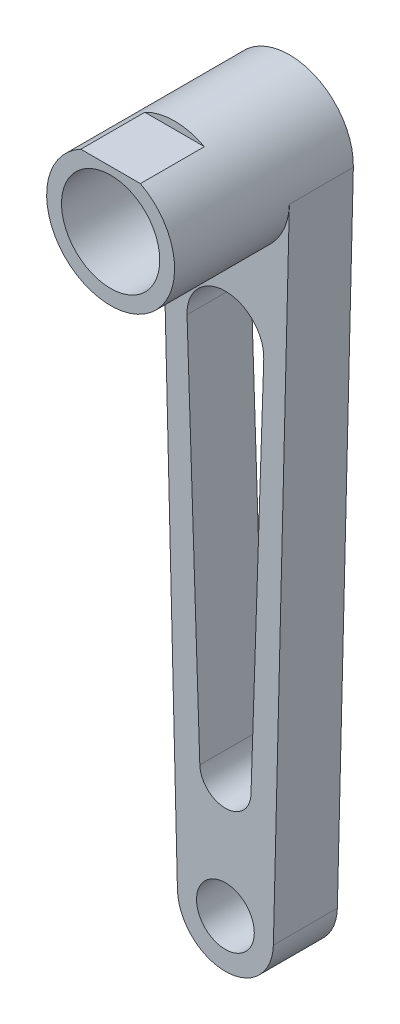
ISO-10303-21;
HEADER;
FILE_DESCRIPTION(('STEP AP214'),'2;1');
FILE_NAME('part.step','',(''),(''),'','','');
FILE_SCHEMA(('AUTOMOTIVE_DESIGN { 1 0 10303 214 1 1 1 1 }'));
ENDSEC;
DATA;
#1=APPLICATION_CONTEXT('core data for automotive mechanical design processes');
#2=APPLICATION_PROTOCOL_DEFINITION('international standard','automotive_design',2000,#1);
#3=PRODUCT_CONTEXT('',#1,'mechanical');
#4=PRODUCT('Part','Part','',(#3));
#5=PRODUCT_RELATED_PRODUCT_CATEGORY('part','',(#4));
#6=PRODUCT_DEFINITION_FORMATION('','',#4);
#7=PRODUCT_DEFINITION_CONTEXT('part definition',#1,'design');
#8=PRODUCT_DEFINITION('design','',#6,#7);
#9=PRODUCT_DEFINITION_SHAPE('','',#8);
#10=(LENGTH_UNIT() NAMED_UNIT(*) SI_UNIT(.MILLI.,.METRE.));
#11=(NAMED_UNIT(*) PLANE_ANGLE_UNIT() SI_UNIT($,.RADIAN.));
#12=(NAMED_UNIT(*) SI_UNIT($,.STERADIAN.) SOLID_ANGLE_UNIT());
#13=UNCERTAINTY_MEASURE_WITH_UNIT(LENGTH_MEASURE(1.E-05),#10,'distance_accuracy_value','');
#14=(GEOMETRIC_REPRESENTATION_CONTEXT(3) GLOBAL_UNCERTAINTY_ASSIGNED_CONTEXT((#13)) GLOBAL_UNIT_ASSIGNED_CONTEXT((#10,
#11,#12)) REPRESENTATION_CONTEXT('',''));
#15=CARTESIAN_POINT('',(0.,0.,0.));
#16=DIRECTION('',(0.,0.,1.));
#17=DIRECTION('',(1.,0.,0.));
#18=AXIS2_PLACEMENT_3D('',#15,#16,#17);
#19=CARTESIAN_POINT('',(0.,-83.,10.));
#20=DIRECTION('',(0.,0.,-1.));
#21=DIRECTION('',(-1.,0.,0.));
#22=AXIS2_PLACEMENT_3D('',#19,#20,#21);
#23=CYLINDRICAL_SURFACE('',#22,4.);
#24=CARTESIAN_POINT('',(0.,-83.,0.));
#25=DIRECTION('',(0.,0.,1.));
#26=DIRECTION('',(1.,0.,0.));
#27=AXIS2_PLACEMENT_3D('',#24,#25,#26);
#28=CIRCLE('',#27,4.);
#29=CARTESIAN_POINT('',(-3.99777716015065,-83.1333333333333,0.));
#30=VERTEX_POINT('',#29);
#31=CARTESIAN_POINT('',(3.99777716015065,-83.1333333333333,0.));
#32=VERTEX_POINT('',#31);
#33=EDGE_CURVE('E162',#30,#32,#28,.T.);
#34=ORIENTED_EDGE('',*,*,#33,.F.);
#35=DIRECTION('',(0.,0.,-1.));
#36=VECTOR('',#35,1.);
#37=CARTESIAN_POINT('',(-3.99777716015065,-83.1333333333333,10.));
#38=LINE('',#37,#36);
#39=CARTESIAN_POINT('',(-3.99777716015065,-83.1333333333333,10.));
#40=VERTEX_POINT('',#39);
#41=EDGE_CURVE('E129',#40,#30,#38,.T.);
#42=ORIENTED_EDGE('',*,*,#41,.F.);
#43=CARTESIAN_POINT('',(0.,-83.,10.));
#44=DIRECTION('',(0.,0.,1.));
#45=DIRECTION('',(1.,0.,0.));
#46=AXIS2_PLACEMENT_3D('',#43,#44,#45);
#47=CIRCLE('',#46,4.);
#48=CARTESIAN_POINT('',(3.99777716015065,-83.1333333333333,10.));
#49=VERTEX_POINT('',#48);
#50=EDGE_CURVE('E135',#40,#49,#47,.T.);
#51=ORIENTED_EDGE('',*,*,#50,.T.);
#52=DIRECTION('',(0.,0.,-1.));
#53=VECTOR('',#52,1.);
#54=CARTESIAN_POINT('',(3.99777716015065,-83.1333333333333,10.));
#55=LINE('',#54,#53);
#56=EDGE_CURVE('E97',#49,#32,#55,.T.);
#57=ORIENTED_EDGE('',*,*,#56,.T.);
#58=EDGE_LOOP('',(#34,#42,#51,#57));
#59=FACE_BOUND('',#58,.T.);
#60=ADVANCED_FACE('F41',(#59),#23,.F.);
#61=CARTESIAN_POINT('',(-6.76290636258819,-0.225555555555556,10.));
#62=DIRECTION('',(0.999444290037663,0.0333333333333333,0.));
#63=DIRECTION('',(-0.0333333333333333,0.999444290037663,0.));
#64=AXIS2_PLACEMENT_3D('',#61,#62,#63);
#65=PLANE('',#64);
#66=DIRECTION('',(0.0333333333333333,-0.999444290037663,0.));
#67=VECTOR('',#66,1.);
#68=CARTESIAN_POINT('',(-6.76290636258819,-0.225555555555556,0.));
#69=LINE('',#68,#67);
#70=CARTESIAN_POINT('',(-5.99666574022598,-23.2,0.));
#71=VERTEX_POINT('',#70);
#72=EDGE_CURVE('E123',#71,#30,#69,.T.);
#73=ORIENTED_EDGE('',*,*,#72,.F.);
#74=DIRECTION('',(0.,0.,-1.));
#75=VECTOR('',#74,1.);
#76=CARTESIAN_POINT('',(-5.99666574022598,-23.2,10.));
#77=LINE('',#76,#75);
#78=CARTESIAN_POINT('',(-5.99666574022598,-23.2,10.));
#79=VERTEX_POINT('',#78);
#80=EDGE_CURVE('E118',#79,#71,#77,.T.);
#81=ORIENTED_EDGE('',*,*,#80,.F.);
#82=DIRECTION('',(0.0333333333333333,-0.999444290037663,0.));
#83=VECTOR('',#82,1.);
#84=CARTESIAN_POINT('',(-6.76290636258819,-0.225555555555556,10.));
#85=LINE('',#84,#83);
#86=EDGE_CURVE('E121',#79,#40,#85,.T.);
#87=ORIENTED_EDGE('',*,*,#86,.T.);
#88=ORIENTED_EDGE('',*,*,#41,.T.);
#89=EDGE_LOOP('',(#73,#81,#87,#88));
#90=FACE_BOUND('',#89,.T.);
#91=ADVANCED_FACE('F120',(#90),#65,.T.);
#92=CARTESIAN_POINT('',(0.,-23.,10.));
#93=DIRECTION('',(0.,0.,-1.));
#94=DIRECTION('',(-1.,0.,0.));
#95=AXIS2_PLACEMENT_3D('',#92,#93,#94);
#96=CYLINDRICAL_SURFACE('',#95,6.);
#97=CARTESIAN_POINT('',(0.,-23.,0.));
#98=DIRECTION('',(0.,0.,1.));
#99=DIRECTION('',(1.,0.,0.));
#100=AXIS2_PLACEMENT_3D('',#97,#98,#99);
#101=CIRCLE('',#100,6.);
#102=CARTESIAN_POINT('',(5.99666574022598,-23.2,0.));
#103=VERTEX_POINT('',#102);
#104=EDGE_CURVE('E168',#103,#71,#101,.T.);
#105=ORIENTED_EDGE('',*,*,#104,.F.);
#106=DIRECTION('',(0.,0.,-1.));
#107=VECTOR('',#106,1.);
#108=CARTESIAN_POINT('',(5.99666574022598,-23.2,10.));
#109=LINE('',#108,#107);
#110=CARTESIAN_POINT('',(5.99666574022598,-23.2,10.));
#111=VERTEX_POINT('',#110);
#112=EDGE_CURVE('E130',#111,#103,#109,.T.);
#113=ORIENTED_EDGE('',*,*,#112,.F.);
#114=CARTESIAN_POINT('',(0.,-23.,10.));
#115=DIRECTION('',(0.,0.,1.));
#116=DIRECTION('',(1.,0.,0.));
#117=AXIS2_PLACEMENT_3D('',#114,#115,#116);
#118=CIRCLE('',#117,6.);
#119=EDGE_CURVE('E134',#111,#79,#118,.T.);
#120=ORIENTED_EDGE('',*,*,#119,.T.);
#121=ORIENTED_EDGE('',*,*,#80,.T.);
#122=EDGE_LOOP('',(#105,#113,#120,#121));
#123=FACE_BOUND('',#122,.T.);
#124=ADVANCED_FACE('F138',(#123),#96,.F.);
#125=CARTESIAN_POINT('',(-9.99697219181418,-0.246062992125984,10.));
#126=DIRECTION('',(0.999697219181418,0.0246062992125984,0.));
#127=DIRECTION('',(-0.0246062992125984,0.999697219181418,0.));
#128=AXIS2_PLACEMENT_3D('',#125,#126,#127);
#129=PLANE('',#128);
#130=DIRECTION('',(0.0246062992125984,-0.999697219181418,0.));
#131=VECTOR('',#130,1.);
#132=CARTESIAN_POINT('',(-9.99697219181418,-0.246062992125984,0.));
#133=LINE('',#132,#131);
#134=CARTESIAN_POINT('',(-9.99697219181418,-0.246062992125984,0.));
#135=VERTEX_POINT('',#134);
#136=CARTESIAN_POINT('',(-7.49772914386064,-101.784547244094,0.));
#137=VERTEX_POINT('',#136);
#138=EDGE_CURVE('E150',#135,#137,#133,.T.);
#139=ORIENTED_EDGE('',*,*,#138,.T.);
#140=DIRECTION('',(0.,0.,-1.));
#141=VECTOR('',#140,1.);
#142=CARTESIAN_POINT('',(-7.49772914386064,-101.784547244094,10.));
#143=LINE('',#142,#141);
#144=CARTESIAN_POINT('',(-7.49772914386064,-101.784547244094,10.));
#145=VERTEX_POINT('',#144);
#146=EDGE_CURVE('E181',#145,#137,#143,.T.);
#147=ORIENTED_EDGE('',*,*,#146,.F.);
#148=DIRECTION('',(0.0246062992125984,-0.999697219181418,0.));
#149=VECTOR('',#148,1.);
#150=CARTESIAN_POINT('',(-9.99697219181418,-0.246062992125984,10.));
#151=LINE('',#150,#149);
#152=CARTESIAN_POINT('',(-9.99697219181418,-0.246062992125984,10.));
#153=VERTEX_POINT('',#152);
#154=EDGE_CURVE('E178',#153,#145,#151,.T.);
#155=ORIENTED_EDGE('',*,*,#154,.F.);
#156=DIRECTION('',(0.,0.,-1.));
#157=VECTOR('',#156,1.);
#158=CARTESIAN_POINT('',(-9.99697219181418,-0.246062992125984,10.));
#159=LINE('',#158,#157);
#160=EDGE_CURVE('E149',#153,#135,#159,.T.);
#161=ORIENTED_EDGE('',*,*,#160,.T.);
#162=EDGE_LOOP('',(#139,#147,#155,#161));
#163=FACE_BOUND('',#162,.T.);
#164=ADVANCED_FACE('F43',(#163),#129,.F.);
#165=CARTESIAN_POINT('',(0.,-101.6,10.));
#166=DIRECTION('',(0.,0.,-1.));
#167=DIRECTION('',(-1.,0.,0.));
#168=AXIS2_PLACEMENT_3D('',#165,#166,#167);
#169=CYLINDRICAL_SURFACE('',#168,7.5);
#170=CARTESIAN_POINT('',(0.,-101.6,0.));
#171=DIRECTION('',(0.,0.,1.));
#172=DIRECTION('',(1.,0.,0.));
#173=AXIS2_PLACEMENT_3D('',#170,#171,#172);
#174=CIRCLE('',#173,7.5);
#175=CARTESIAN_POINT('',(7.49772914386064,-101.784547244094,0.));
#176=VERTEX_POINT('',#175);
#177=EDGE_CURVE('E154',#137,#176,#174,.T.);
#178=ORIENTED_EDGE('',*,*,#177,.T.);
#179=DIRECTION('',(0.,0.,-1.));
#180=VECTOR('',#179,1.);
#181=CARTESIAN_POINT('',(7.49772914386064,-101.784547244094,10.));
#182=LINE('',#181,#180);
#183=CARTESIAN_POINT('',(7.49772914386064,-101.784547244094,10.));
#184=VERTEX_POINT('',#183);
#185=EDGE_CURVE('E193',#184,#176,#182,.T.);
#186=ORIENTED_EDGE('',*,*,#185,.F.);
#187=CARTESIAN_POINT('',(0.,-101.6,10.));
#188=DIRECTION('',(0.,0.,1.));
#189=DIRECTION('',(1.,0.,0.));
#190=AXIS2_PLACEMENT_3D('',#187,#188,#189);
#191=CIRCLE('',#190,7.5);
#192=EDGE_CURVE('E106',#145,#184,#191,.T.);
#193=ORIENTED_EDGE('',*,*,#192,.F.);
#194=ORIENTED_EDGE('',*,*,#146,.T.);
#195=EDGE_LOOP('',(#178,#186,#193,#194));
#196=FACE_BOUND('',#195,.T.);
#197=ADVANCED_FACE('F264',(#196),#169,.T.);
#198=CARTESIAN_POINT('',(9.99697219181418,-0.246062992125984,10.));
#199=DIRECTION('',(-0.999697219181418,0.0246062992125984,0.));
#200=DIRECTION('',(-0.0246062992125984,-0.999697219181418,0.));
#201=AXIS2_PLACEMENT_3D('',#198,#199,#200);
#202=PLANE('',#201);
#203=DIRECTION('',(0.0246062992125984,0.999697219181418,0.));
#204=VECTOR('',#203,1.);
#205=CARTESIAN_POINT('',(9.99697219181418,-0.246062992125984,0.));
#206=LINE('',#205,#204);
#207=CARTESIAN_POINT('',(9.99697219181418,-0.246062992125984,0.));
#208=VERTEX_POINT('',#207);
#209=EDGE_CURVE('E158',#176,#208,#206,.T.);
#210=ORIENTED_EDGE('',*,*,#209,.T.);
#211=DIRECTION('',(0.,0.,-1.));
#212=VECTOR('',#211,1.);
#213=CARTESIAN_POINT('',(9.99697219181418,-0.246062992125984,10.));
#214=LINE('',#213,#212);
#215=CARTESIAN_POINT('',(9.99697219181418,-0.246062992125984,10.));
#216=VERTEX_POINT('',#215);
#217=EDGE_CURVE('E189',#216,#208,#214,.T.);
#218=ORIENTED_EDGE('',*,*,#217,.F.);
#219=DIRECTION('',(0.0246062992125984,0.999697219181418,0.));
#220=VECTOR('',#219,1.);
#221=CARTESIAN_POINT('',(9.99697219181418,-0.246062992125984,10.));
#222=LINE('',#221,#220);
#223=EDGE_CURVE('E240',#184,#216,#222,.T.);
#224=ORIENTED_EDGE('',*,*,#223,.F.);
#225=ORIENTED_EDGE('',*,*,#185,.T.);
#226=EDGE_LOOP('',(#210,#218,#224,#225));
#227=FACE_BOUND('',#226,.T.);
#228=ADVANCED_FACE('F256',(#227),#202,.F.);
#229=CARTESIAN_POINT('',(6.76290636258819,-0.225555555555556,10.));
#230=DIRECTION('',(0.999444290037663,-0.0333333333333333,0.));
#231=DIRECTION('',(0.0333333333333333,0.999444290037663,0.));
#232=AXIS2_PLACEMENT_3D('',#229,#230,#231);
#233=PLANE('',#232);
#234=DIRECTION('',(-0.0333333333333333,-0.999444290037663,0.));
#235=VECTOR('',#234,1.);
#236=CARTESIAN_POINT('',(6.76290636258819,-0.225555555555556,0.));
#237=LINE('',#236,#235);
#238=EDGE_CURVE('E171',#103,#32,#237,.T.);
#239=ORIENTED_EDGE('',*,*,#238,.T.);
#240=ORIENTED_EDGE('',*,*,#56,.F.);
#241=DIRECTION('',(-0.0333333333333333,-0.999444290037663,0.));
#242=VECTOR('',#241,1.);
#243=CARTESIAN_POINT('',(6.76290636258819,-0.225555555555556,10.));
#244=LINE('',#243,#242);
#245=EDGE_CURVE('E66',#111,#49,#244,.T.);
#246=ORIENTED_EDGE('',*,*,#245,.F.);
#247=ORIENTED_EDGE('',*,*,#112,.T.);
#248=EDGE_LOOP('',(#239,#240,#246,#247));
#249=FACE_BOUND('',#248,.T.);
#250=ADVANCED_FACE('F253',(#249),#233,.F.);
#251=CARTESIAN_POINT('',(0.,-101.6,10.));
#252=DIRECTION('',(0.,0.,-1.));
#253=DIRECTION('',(-1.,0.,0.));
#254=AXIS2_PLACEMENT_3D('',#251,#252,#253);
#255=CYLINDRICAL_SURFACE('',#254,4.515);
#256=CARTESIAN_POINT('',(0.,-101.6,10.));
#257=DIRECTION('',(0.,0.,1.));
#258=DIRECTION('',(1.,0.,0.));
#259=AXIS2_PLACEMENT_3D('',#256,#257,#258);
#260=CIRCLE('',#259,4.515);
#261=CARTESIAN_POINT('',(4.515,-101.6,10.));
#262=VERTEX_POINT('',#261);
#263=EDGE_CURVE('E142',#262,#262,#260,.T.);
#264=ORIENTED_EDGE('',*,*,#263,.T.);
#265=EDGE_LOOP('',(#264));
#266=FACE_BOUND('',#265,.T.);
#267=CARTESIAN_POINT('',(0.,-101.6,0.));
#268=DIRECTION('',(0.,0.,1.));
#269=DIRECTION('',(1.,0.,0.));
#270=AXIS2_PLACEMENT_3D('',#267,#268,#269);
#271=CIRCLE('',#270,4.515);
#272=CARTESIAN_POINT('',(4.515,-101.6,0.));
#273=VERTEX_POINT('',#272);
#274=EDGE_CURVE('E174',#273,#273,#271,.T.);
#275=ORIENTED_EDGE('',*,*,#274,.F.);
#276=EDGE_LOOP('',(#275));
#277=FACE_BOUND('',#276,.T.);
#278=ADVANCED_FACE('F255',(#266,#277),#255,.F.);
#279=CARTESIAN_POINT('',(0.,0.,10.));
#280=DIRECTION('',(0.,0.,1.));
#281=DIRECTION('',(1.,0.,0.));
#282=AXIS2_PLACEMENT_3D('',#279,#280,#281);
#283=PLANE('',#282);
#284=ORIENTED_EDGE('',*,*,#154,.T.);
#285=ORIENTED_EDGE('',*,*,#192,.T.);
#286=ORIENTED_EDGE('',*,*,#223,.T.);
#287=CARTESIAN_POINT('',(0.,0.,10.));
#288=DIRECTION('',(0.,0.,1.));
#289=DIRECTION('',(1.,0.,0.));
#290=AXIS2_PLACEMENT_3D('',#287,#288,#289);
#291=CIRCLE('',#290,10.);
#292=EDGE_CURVE('E244',#153,#216,#291,.T.);
#293=ORIENTED_EDGE('',*,*,#292,.F.);
#294=EDGE_LOOP('',(#284,#285,#286,#293));
#295=FACE_BOUND('',#294,.T.);
#296=ORIENTED_EDGE('',*,*,#50,.F.);
#297=ORIENTED_EDGE('',*,*,#86,.F.);
#298=ORIENTED_EDGE('',*,*,#119,.F.);
#299=ORIENTED_EDGE('',*,*,#245,.T.);
#300=EDGE_LOOP('',(#296,#297,#298,#299));
#301=FACE_BOUND('',#300,.T.);
#302=ORIENTED_EDGE('',*,*,#263,.F.);
#303=EDGE_LOOP('',(#302));
#304=FACE_BOUND('',#303,.T.);
#305=ADVANCED_FACE('F132',(#295,#301,#304),#283,.T.);
#306=CARTESIAN_POINT('',(0.,0.,0.));
#307=DIRECTION('',(0.,0.,1.));
#308=DIRECTION('',(1.,0.,0.));
#309=AXIS2_PLACEMENT_3D('',#306,#307,#308);
#310=PLANE('',#309);
#311=ORIENTED_EDGE('',*,*,#138,.F.);
#312=CARTESIAN_POINT('',(0.,0.,0.));
#313=DIRECTION('',(0.,0.,1.));
#314=DIRECTION('',(1.,0.,0.));
#315=AXIS2_PLACEMENT_3D('',#312,#313,#314);
#316=CIRCLE('',#315,10.);
#317=EDGE_CURVE('E225',#208,#135,#316,.T.);
#318=ORIENTED_EDGE('',*,*,#317,.F.);
#319=ORIENTED_EDGE('',*,*,#209,.F.);
#320=ORIENTED_EDGE('',*,*,#177,.F.);
#321=EDGE_LOOP('',(#311,#318,#319,#320));
#322=FACE_BOUND('',#321,.T.);
#323=ORIENTED_EDGE('',*,*,#33,.T.);
#324=ORIENTED_EDGE('',*,*,#238,.F.);
#325=ORIENTED_EDGE('',*,*,#104,.T.);
#326=ORIENTED_EDGE('',*,*,#72,.T.);
#327=EDGE_LOOP('',(#323,#324,#325,#326));
#328=FACE_BOUND('',#327,.T.);
#329=ORIENTED_EDGE('',*,*,#274,.T.);
#330=EDGE_LOOP('',(#329));
#331=FACE_BOUND('',#330,.T.);
#332=CARTESIAN_POINT('',(0.,0.,0.));
#333=DIRECTION('',(0.,0.,1.));
#334=DIRECTION('',(1.,0.,0.));
#335=AXIS2_PLACEMENT_3D('',#332,#333,#334);
#336=CIRCLE('',#335,7.675);
#337=CARTESIAN_POINT('',(7.675,0.,0.));
#338=VERTEX_POINT('',#337);
#339=EDGE_CURVE('E229',#338,#338,#336,.T.);
#340=ORIENTED_EDGE('',*,*,#339,.T.);
#341=EDGE_LOOP('',(#340));
#342=FACE_BOUND('',#341,.T.);
#343=ADVANCED_FACE('F250',(#322,#328,#331,#342),#310,.F.);
#344=CARTESIAN_POINT('',(0.,0.,27.94));
#345=DIRECTION('',(0.,0.,-1.));
#346=DIRECTION('',(-1.,0.,0.));
#347=AXIS2_PLACEMENT_3D('',#344,#345,#346);
#348=CYLINDRICAL_SURFACE('',#347,10.);
#349=CARTESIAN_POINT('',(0.,0.,27.94));
#350=DIRECTION('',(0.,0.,1.));
#351=DIRECTION('',(1.,0.,0.));
#352=AXIS2_PLACEMENT_3D('',#349,#350,#351);
#353=CIRCLE('',#352,10.);
#354=CARTESIAN_POINT('',(-4.65591022250215,8.85,27.94));
#355=VERTEX_POINT('',#354);
#356=CARTESIAN_POINT('',(4.65591022250215,8.85,27.94));
#357=VERTEX_POINT('',#356);
#358=EDGE_CURVE('E155',#355,#357,#353,.T.);
#359=ORIENTED_EDGE('',*,*,#358,.F.);
#360=DIRECTION('',(0.,0.,-1.));
#361=VECTOR('',#360,1.);
#362=CARTESIAN_POINT('',(-4.65591022250215,8.85,27.94));
#363=LINE('',#362,#361);
#364=CARTESIAN_POINT('',(-4.65591022250215,8.85,17.94));
#365=VERTEX_POINT('',#364);
#366=EDGE_CURVE('E57',#355,#365,#363,.T.);
#367=ORIENTED_EDGE('',*,*,#366,.T.);
#368=CARTESIAN_POINT('',(0.,0.,17.94));
#369=DIRECTION('',(0.,0.,1.));
#370=DIRECTION('',(1.,0.,0.));
#371=AXIS2_PLACEMENT_3D('',#368,#369,#370);
#372=CIRCLE('',#371,10.);
#373=CARTESIAN_POINT('',(4.65591022250215,8.85,17.94));
#374=VERTEX_POINT('',#373);
#375=EDGE_CURVE('E11',#374,#365,#372,.T.);
#376=ORIENTED_EDGE('',*,*,#375,.F.);
#377=DIRECTION('',(0.,0.,-1.));
#378=VECTOR('',#377,1.);
#379=CARTESIAN_POINT('',(4.65591022250215,8.85,27.94));
#380=LINE('',#379,#378);
#381=EDGE_CURVE('E204',#374,#357,#380,.F.);
#382=ORIENTED_EDGE('',*,*,#381,.T.);
#383=EDGE_LOOP('',(#359,#367,#376,#382));
#384=FACE_BOUND('',#383,.T.);
#385=ORIENTED_EDGE('',*,*,#317,.T.);
#386=ORIENTED_EDGE('',*,*,#160,.F.);
#387=ORIENTED_EDGE('',*,*,#292,.T.);
#388=ORIENTED_EDGE('',*,*,#217,.T.);
#389=EDGE_LOOP('',(#385,#386,#387,#388));
#390=FACE_BOUND('',#389,.T.);
#391=ADVANCED_FACE('F213',(#384,#390),#348,.T.);
#392=CARTESIAN_POINT('',(0.,0.,27.94));
#393=DIRECTION('',(0.,0.,-1.));
#394=DIRECTION('',(-1.,0.,0.));
#395=AXIS2_PLACEMENT_3D('',#392,#393,#394);
#396=CYLINDRICAL_SURFACE('',#395,7.675);
#397=CARTESIAN_POINT('',(0.,0.,27.94));
#398=DIRECTION('',(0.,0.,1.));
#399=DIRECTION('',(1.,0.,0.));
#400=AXIS2_PLACEMENT_3D('',#397,#398,#399);
#401=CIRCLE('',#400,7.675);
#402=CARTESIAN_POINT('',(7.675,0.,27.94));
#403=VERTEX_POINT('',#402);
#404=EDGE_CURVE('E221',#403,#403,#401,.T.);
#405=ORIENTED_EDGE('',*,*,#404,.T.);
#406=EDGE_LOOP('',(#405));
#407=FACE_BOUND('',#406,.T.);
#408=ORIENTED_EDGE('',*,*,#339,.F.);
#409=EDGE_LOOP('',(#408));
#410=FACE_BOUND('',#409,.T.);
#411=ADVANCED_FACE('F304',(#407,#410),#396,.F.);
#412=CARTESIAN_POINT('',(0.,0.,27.94));
#413=DIRECTION('',(0.,0.,1.));
#414=DIRECTION('',(1.,0.,0.));
#415=AXIS2_PLACEMENT_3D('',#412,#413,#414);
#416=PLANE('',#415);
#417=DIRECTION('',(1.,0.,0.));
#418=VECTOR('',#417,1.);
#419=CARTESIAN_POINT('',(0.,8.85,27.94));
#420=LINE('',#419,#418);
#421=EDGE_CURVE('E50',#355,#357,#420,.T.);
#422=ORIENTED_EDGE('',*,*,#421,.F.);
#423=ORIENTED_EDGE('',*,*,#358,.T.);
#424=EDGE_LOOP('',(#422,#423));
#425=FACE_BOUND('',#424,.T.);
#426=ORIENTED_EDGE('',*,*,#404,.F.);
#427=EDGE_LOOP('',(#426));
#428=FACE_BOUND('',#427,.T.);
#429=ADVANCED_FACE('F218',(#425,#428),#416,.T.);
#430=CARTESIAN_POINT('',(0.,0.,17.94));
#431=DIRECTION('',(0.,0.,1.));
#432=DIRECTION('',(1.,0.,0.));
#433=AXIS2_PLACEMENT_3D('',#430,#431,#432);
#434=PLANE('',#433);
#435=ORIENTED_EDGE('',*,*,#375,.T.);
#436=DIRECTION('',(1.,0.,0.));
#437=VECTOR('',#436,1.);
#438=CARTESIAN_POINT('',(-10.0333038110801,8.85,17.94));
#439=LINE('',#438,#437);
#440=EDGE_CURVE('E216',#365,#374,#439,.T.);
#441=ORIENTED_EDGE('',*,*,#440,.T.);
#442=EDGE_LOOP('',(#435,#441));
#443=FACE_BOUND('',#442,.T.);
#444=ADVANCED_FACE('F293',(#443),#434,.T.);
#445=CARTESIAN_POINT('',(-10.0333038110801,8.85,17.94));
#446=DIRECTION('',(0.,-1.,0.));
#447=DIRECTION('',(0.,0.,-1.));
#448=AXIS2_PLACEMENT_3D('',#445,#446,#447);
#449=PLANE('',#448);
#450=ORIENTED_EDGE('',*,*,#421,.T.);
#451=ORIENTED_EDGE('',*,*,#381,.F.);
#452=ORIENTED_EDGE('',*,*,#440,.F.);
#453=ORIENTED_EDGE('',*,*,#366,.F.);
#454=EDGE_LOOP('',(#450,#451,#452,#453));
#455=FACE_BOUND('',#454,.T.);
#456=ADVANCED_FACE('F202',(#455),#449,.F.);
#457=CLOSED_SHELL('',(#60,#91,#124,#164,#197,#228,#250,#278,#305,#343,#391,#411,#429,#444,#456));
#458=MANIFOLD_SOLID_BREP('B2',#457);
#459=ADVANCED_BREP_SHAPE_REPRESENTATION('',(#18,#458),#14);
#460=SHAPE_DEFINITION_REPRESENTATION(#9,#459);
ENDSEC;
END-ISO-10303-21;
